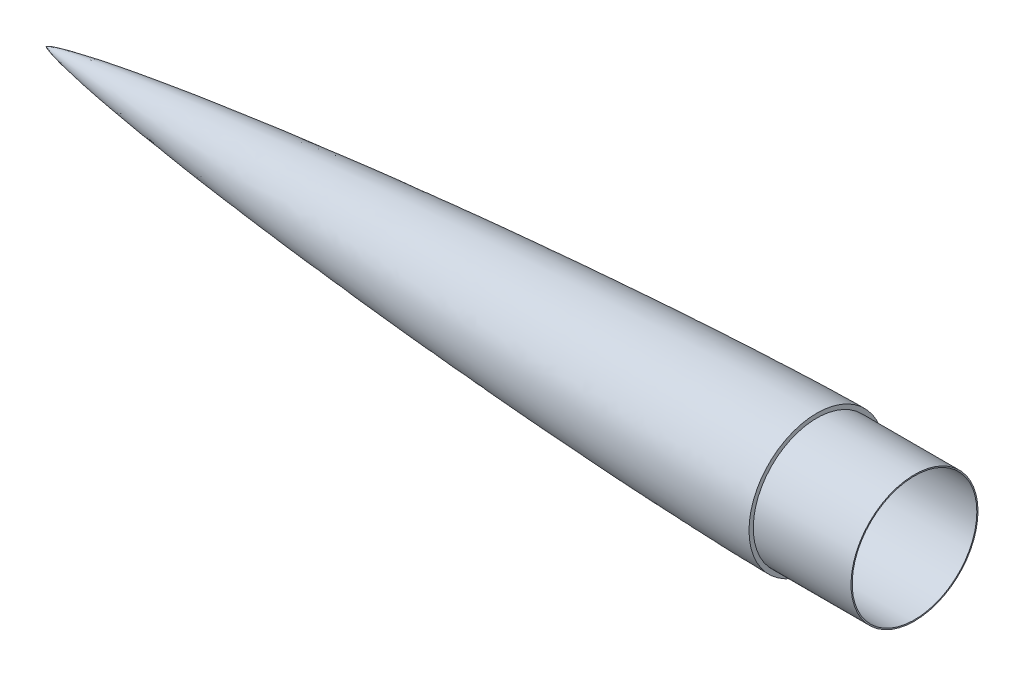
ISO-10303-21;
HEADER;
FILE_DESCRIPTION(('STEP AP214'),'2;1');
FILE_NAME('part.step','',(''),(''),'','','');
FILE_SCHEMA(('AUTOMOTIVE_DESIGN { 1 0 10303 214 1 1 1 1 }'));
ENDSEC;
DATA;
#1=APPLICATION_CONTEXT('core data for automotive mechanical design processes');
#2=APPLICATION_PROTOCOL_DEFINITION('international standard','automotive_design',2000,#1);
#3=PRODUCT_CONTEXT('',#1,'mechanical');
#4=PRODUCT('Part','Part','',(#3));
#5=PRODUCT_RELATED_PRODUCT_CATEGORY('part','',(#4));
#6=PRODUCT_DEFINITION_FORMATION('','',#4);
#7=PRODUCT_DEFINITION_CONTEXT('part definition',#1,'design');
#8=PRODUCT_DEFINITION('design','',#6,#7);
#9=PRODUCT_DEFINITION_SHAPE('','',#8);
#10=(LENGTH_UNIT() NAMED_UNIT(*) SI_UNIT(.MILLI.,.METRE.));
#11=(NAMED_UNIT(*) PLANE_ANGLE_UNIT() SI_UNIT($,.RADIAN.));
#12=(NAMED_UNIT(*) SI_UNIT($,.STERADIAN.) SOLID_ANGLE_UNIT());
#13=UNCERTAINTY_MEASURE_WITH_UNIT(LENGTH_MEASURE(1.E-05),#10,'distance_accuracy_value','');
#14=(GEOMETRIC_REPRESENTATION_CONTEXT(3) GLOBAL_UNCERTAINTY_ASSIGNED_CONTEXT((#13)) GLOBAL_UNIT_ASSIGNED_CONTEXT((#10,
#11,#12)) REPRESENTATION_CONTEXT('',''));
#15=CARTESIAN_POINT('',(0.,0.,0.));
#16=DIRECTION('',(0.,0.,1.));
#17=DIRECTION('',(1.,0.,0.));
#18=AXIS2_PLACEMENT_3D('',#15,#16,#17);
#19=CARTESIAN_POINT('',(451.,39.65,0.));
#20=CARTESIAN_POINT('',(449.550205570083,39.6468156375158,0.));
#21=CARTESIAN_POINT('',(446.650694999574,39.6227018693949,0.));
#22=CARTESIAN_POINT('',(440.851982052909,39.5471800335853,0.));
#23=CARTESIAN_POINT('',(431.587662282075,39.3656843683889,0.));
#24=CARTESIAN_POINT('',(420.308211796973,39.0764170222885,0.));
#25=CARTESIAN_POINT('',(403.54946390216,38.5475601877334,0.));
#26=CARTESIAN_POINT('',(382.763491854675,37.7493247187442,0.));
#27=CARTESIAN_POINT('',(358.520267123373,36.6486006079984,0.));
#28=CARTESIAN_POINT('',(330.82351332863,35.1920099629382,0.));
#29=CARTESIAN_POINT('',(303.136821137193,33.5557754264809,0.));
#30=CARTESIAN_POINT('',(275.460677162263,31.7501292415502,0.));
#31=CARTESIAN_POINT('',(247.795785790523,29.7795752363478,0.));
#32=CARTESIAN_POINT('',(220.14317337785,27.6436217247148,0.));
#33=CARTESIAN_POINT('',(192.504223184193,25.3372992080707,0.));
#34=CARTESIAN_POINT('',(164.880967366622,22.8498872661611,0.));
#35=CARTESIAN_POINT('',(137.276216784454,20.1640826523402,0.));
#36=CARTESIAN_POINT('',(109.694474906344,17.2509085116426,0.));
#37=CARTESIAN_POINT('',(82.1426890372348,14.0646060004399,0.));
#38=CARTESIAN_POINT('',(57.1012251431119,10.8381097624904,0.));
#39=CARTESIAN_POINT('',(36.3041458677579,7.80199254737409,0.));
#40=CARTESIAN_POINT('',(20.997899725335,5.2074535324598,0.));
#41=CARTESIAN_POINT('',(11.8038624577938,3.3923485204884,0.));
#42=CARTESIAN_POINT('',(6.59217511694145,2.19256544944891,0.));
#43=CARTESIAN_POINT('',(3.80352222382998,1.45038515628273,0.));
#44=CARTESIAN_POINT('',(2.29094260087528,0.990255514491683,0.));
#45=CARTESIAN_POINT('',(1.44771534808698,0.700810439611768,0.));
#46=CARTESIAN_POINT('',(0.978806956028304,0.521481953922238,0.));
#47=CARTESIAN_POINT('',(0.705937543968439,0.407366654735678,0.));
#48=CARTESIAN_POINT('',(0.530135292556266,0.328212169031833,0.));
#49=CARTESIAN_POINT('',(0.408604964960222,0.270245957635337,0.));
#50=CARTESIAN_POINT('',(0.302732494468423,0.215977447747647,0.));
#51=CARTESIAN_POINT('',(0.212480734005381,0.165700096455984,0.));
#52=CARTESIAN_POINT('',(0.137290098371198,0.119470754608784,0.));
#53=CARTESIAN_POINT('',(0.0843672890943474,0.0832631686051162,0.));
#54=CARTESIAN_POINT('',(0.0448704256245154,0.0519874639984805,0.));
#55=CARTESIAN_POINT('',(0.018396222888829,0.0265672624985292,0.));
#56=CARTESIAN_POINT('',(0.0068081200076885,0.0123122450020105,0.));
#57=CARTESIAN_POINT('',(0.00250630235993204,0.00425030751186832,0.));
#58=CARTESIAN_POINT('',(0.00070124647328992,0.,0.));
#59=B_SPLINE_CURVE_WITH_KNOTS('',4,(#19,#20,#21,#22,#23,#24,#25,#26,#27,#28,#29,#30,#31,#32,#33,
#34,#35,#36,#37,#38,#39,#40,#41,#42,#43,#44,#45,#46,#47,#48,#49,#50,#51,#52,#53,#54,#55,#56,#57,
#58),.UNSPECIFIED.,.F.,.F.,(5,1,1,1,1,1,1,1,1,1,1,1,1,1,1,1,1,1,1,1,1,1,1,1,1,1,1,1,1,1,1,1,1,1,
1,1,5),(0.,0.0127915012886014,0.0255830025772028,0.0511660051544057,0.0817539593192327,
0.11234191348406,0.173517822237356,0.234693730971405,0.295869638996534,0.35704554728737,
0.418221455789203,0.479397364458255,0.540573273252067,0.601749181857603,0.662925090021709,
0.724100998340426,0.785276907118453,0.846452814186692,0.907628715985927,0.946859825309263,
0.970700703574196,0.98341231172882,0.990301784575929,0.994037304663778,0.996156583047533,
0.99735888328297,0.998166103124994,0.998465932725196,0.998765762325398,0.999059854555611,
0.999353946785824,0.999515460089368,0.999676973392912,0.999838486696456,0.999919243348228,
0.999959621674114,1.),.UNSPECIFIED.);
#60=CARTESIAN_POINT('',(0.000701246473234408,0.,0.));
#61=DIRECTION('',(-1.,0.,0.));
#62=AXIS1_PLACEMENT('',#60,#61);
#63=SURFACE_OF_REVOLUTION('',#59,#62);
#64=CARTESIAN_POINT('',(0.000701246473234408,0.,0.));
#65=VERTEX_POINT('',#64);
#66=VERTEX_LOOP('',#65);
#67=FACE_BOUND('',#66,.T.);
#68=CARTESIAN_POINT('',(451.,0.,0.));
#69=DIRECTION('',(-1.,0.,0.));
#70=DIRECTION('',(0.,-1.,0.));
#71=AXIS2_PLACEMENT_3D('',#68,#69,#70);
#72=CIRCLE('',#71,39.65);
#73=CARTESIAN_POINT('',(451.,-39.65,0.));
#74=VERTEX_POINT('',#73);
#75=EDGE_CURVE('E53',#74,#74,#72,.T.);
#76=ORIENTED_EDGE('',*,*,#75,.T.);
#77=EDGE_LOOP('',(#76));
#78=FACE_BOUND('',#77,.T.);
#79=ADVANCED_FACE('F45',(#67,#78),#63,.T.);
#80=CARTESIAN_POINT('',(451.,39.65,0.));
#81=DIRECTION('',(-1.,0.,0.));
#82=DIRECTION('',(0.,-1.,0.));
#83=AXIS2_PLACEMENT_3D('',#80,#81,#82);
#84=PLANE('',#83);
#85=CARTESIAN_POINT('',(451.,0.,0.));
#86=DIRECTION('',(-1.,0.,0.));
#87=DIRECTION('',(0.,-1.,0.));
#88=AXIS2_PLACEMENT_3D('',#85,#86,#87);
#89=CIRCLE('',#88,37.15);
#90=CARTESIAN_POINT('',(451.,-37.15,0.));
#91=VERTEX_POINT('',#90);
#92=EDGE_CURVE('E11',#91,#91,#89,.F.);
#93=ORIENTED_EDGE('',*,*,#92,.F.);
#94=EDGE_LOOP('',(#93));
#95=FACE_BOUND('',#94,.T.);
#96=ORIENTED_EDGE('',*,*,#75,.F.);
#97=EDGE_LOOP('',(#96));
#98=FACE_BOUND('',#97,.T.);
#99=ADVANCED_FACE('F58',(#95,#98),#84,.F.);
#100=CARTESIAN_POINT('',(508.2,0.,0.));
#101=DIRECTION('',(-1.,0.,0.));
#102=DIRECTION('',(0.,0.,1.));
#103=AXIS2_PLACEMENT_3D('',#100,#101,#102);
#104=CYLINDRICAL_SURFACE('',#103,37.15);
#105=CARTESIAN_POINT('',(508.2,0.,0.));
#106=DIRECTION('',(1.,0.,0.));
#107=DIRECTION('',(0.,0.,-1.));
#108=AXIS2_PLACEMENT_3D('',#105,#106,#107);
#109=CIRCLE('',#108,37.15);
#110=CARTESIAN_POINT('',(508.2,0.,-37.15));
#111=VERTEX_POINT('',#110);
#112=EDGE_CURVE('E63',#111,#111,#109,.T.);
#113=ORIENTED_EDGE('',*,*,#112,.F.);
#114=EDGE_LOOP('',(#113));
#115=FACE_BOUND('',#114,.T.);
#116=ORIENTED_EDGE('',*,*,#92,.T.);
#117=EDGE_LOOP('',(#116));
#118=FACE_BOUND('',#117,.T.);
#119=ADVANCED_FACE('F94',(#115,#118),#104,.T.);
#120=CARTESIAN_POINT('',(508.2,0.,0.));
#121=DIRECTION('',(1.,0.,0.));
#122=DIRECTION('',(0.,0.,-1.));
#123=AXIS2_PLACEMENT_3D('',#120,#121,#122);
#124=PLANE('',#123);
#125=CARTESIAN_POINT('',(508.2,0.,0.));
#126=DIRECTION('',(1.,0.,0.));
#127=DIRECTION('',(0.,0.,-1.));
#128=AXIS2_PLACEMENT_3D('',#125,#126,#127);
#129=CIRCLE('',#128,36.465);
#130=CARTESIAN_POINT('',(508.2,0.,-36.465));
#131=VERTEX_POINT('',#130);
#132=EDGE_CURVE('E75',#131,#131,#129,.T.);
#133=ORIENTED_EDGE('',*,*,#132,.F.);
#134=EDGE_LOOP('',(#133));
#135=FACE_BOUND('',#134,.T.);
#136=ORIENTED_EDGE('',*,*,#112,.T.);
#137=EDGE_LOOP('',(#136));
#138=FACE_BOUND('',#137,.T.);
#139=ADVANCED_FACE('F88',(#135,#138),#124,.T.);
#140=CARTESIAN_POINT('',(451.,0.,0.));
#141=DIRECTION('',(1.,0.,0.));
#142=DIRECTION('',(0.,0.,-1.));
#143=AXIS2_PLACEMENT_3D('',#140,#141,#142);
#144=CYLINDRICAL_SURFACE('',#143,36.465);
#145=CARTESIAN_POINT('',(451.,0.,0.));
#146=DIRECTION('',(1.,0.,0.));
#147=DIRECTION('',(0.,0.,-1.));
#148=AXIS2_PLACEMENT_3D('',#145,#146,#147);
#149=CIRCLE('',#148,36.465);
#150=CARTESIAN_POINT('',(451.,0.,-36.465));
#151=VERTEX_POINT('',#150);
#152=EDGE_CURVE('E66',#151,#151,#149,.T.);
#153=ORIENTED_EDGE('',*,*,#152,.F.);
#154=EDGE_LOOP('',(#153));
#155=FACE_BOUND('',#154,.T.);
#156=ORIENTED_EDGE('',*,*,#132,.T.);
#157=EDGE_LOOP('',(#156));
#158=FACE_BOUND('',#157,.T.);
#159=ADVANCED_FACE('F85',(#155,#158),#144,.F.);
#160=CARTESIAN_POINT('',(451.,0.,0.));
#161=DIRECTION('',(1.,0.,0.));
#162=DIRECTION('',(0.,0.,-1.));
#163=AXIS2_PLACEMENT_3D('',#160,#161,#162);
#164=PLANE('',#163);
#165=ORIENTED_EDGE('',*,*,#152,.T.);
#166=EDGE_LOOP('',(#165));
#167=FACE_BOUND('',#166,.T.);
#168=ADVANCED_FACE('F83',(#167),#164,.T.);
#169=CLOSED_SHELL('',(#79,#99,#119,#139,#159,#168));
#170=MANIFOLD_SOLID_BREP('B2',#169);
#171=ADVANCED_BREP_SHAPE_REPRESENTATION('',(#18,#170),#14);
#172=SHAPE_DEFINITION_REPRESENTATION(#9,#171);
ENDSEC;
END-ISO-10303-21;
